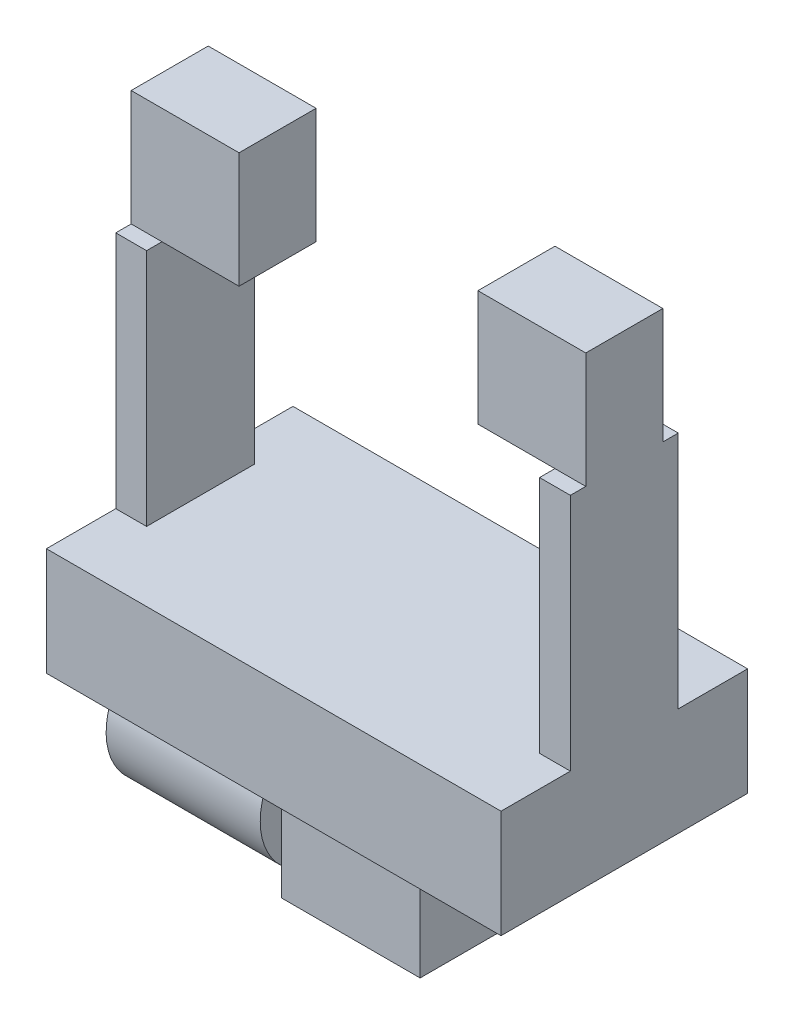
ISO-10303-21;
HEADER;
FILE_DESCRIPTION(('STEP AP214'),'2;1');
FILE_NAME('part.step','',(''),(''),'','','');
FILE_SCHEMA(('AUTOMOTIVE_DESIGN { 1 0 10303 214 1 1 1 1 }'));
ENDSEC;
DATA;
#1=APPLICATION_CONTEXT('core data for automotive mechanical design processes');
#2=APPLICATION_PROTOCOL_DEFINITION('international standard','automotive_design',2000,#1);
#3=PRODUCT_CONTEXT('',#1,'mechanical');
#4=PRODUCT('Part','Part','',(#3));
#5=PRODUCT_RELATED_PRODUCT_CATEGORY('part','',(#4));
#6=PRODUCT_DEFINITION_FORMATION('','',#4);
#7=PRODUCT_DEFINITION_CONTEXT('part definition',#1,'design');
#8=PRODUCT_DEFINITION('design','',#6,#7);
#9=PRODUCT_DEFINITION_SHAPE('','',#8);
#10=(LENGTH_UNIT() NAMED_UNIT(*) SI_UNIT(.MILLI.,.METRE.));
#11=(NAMED_UNIT(*) PLANE_ANGLE_UNIT() SI_UNIT($,.RADIAN.));
#12=(NAMED_UNIT(*) SI_UNIT($,.STERADIAN.) SOLID_ANGLE_UNIT());
#13=UNCERTAINTY_MEASURE_WITH_UNIT(LENGTH_MEASURE(1.E-05),#10,'distance_accuracy_value','');
#14=(GEOMETRIC_REPRESENTATION_CONTEXT(3) GLOBAL_UNCERTAINTY_ASSIGNED_CONTEXT((#13)) GLOBAL_UNIT_ASSIGNED_CONTEXT((#10,
#11,#12)) REPRESENTATION_CONTEXT('',''));
#15=CARTESIAN_POINT('',(0.,0.,0.));
#16=DIRECTION('',(0.,0.,1.));
#17=DIRECTION('',(1.,0.,0.));
#18=AXIS2_PLACEMENT_3D('',#15,#16,#17);
#19=CARTESIAN_POINT('',(-11.43,-8.89,7.62));
#20=DIRECTION('',(1.,0.,0.));
#21=DIRECTION('',(0.,1.,0.));
#22=AXIS2_PLACEMENT_3D('',#19,#20,#21);
#23=PLANE('',#22);
#24=CARTESIAN_POINT('',(-11.43,-21.59,0.));
#25=DIRECTION('',(-1.,0.,0.));
#26=DIRECTION('',(0.,-1.,0.));
#27=AXIS2_PLACEMENT_3D('',#24,#25,#26);
#28=CIRCLE('',#27,11.1125);
#29=CARTESIAN_POINT('',(-11.43,-13.5015356061858,7.62));
#30=VERTEX_POINT('',#29);
#31=CARTESIAN_POINT('',(-11.43,-13.5015356061858,-7.62));
#32=VERTEX_POINT('',#31);
#33=EDGE_CURVE('E67',#30,#32,#28,.T.);
#34=ORIENTED_EDGE('',*,*,#33,.F.);
#35=DIRECTION('',(0.,-1.,0.));
#36=VECTOR('',#35,1.);
#37=CARTESIAN_POINT('',(-11.43,-8.89,7.62));
#38=LINE('',#37,#36);
#39=CARTESIAN_POINT('',(-11.43,-8.89,7.62));
#40=VERTEX_POINT('',#39);
#41=EDGE_CURVE('E242',#40,#30,#38,.T.);
#42=ORIENTED_EDGE('',*,*,#41,.F.);
#43=DIRECTION('',(0.,0.,-1.));
#44=VECTOR('',#43,1.);
#45=CARTESIAN_POINT('',(-11.43,-8.89,7.62));
#46=LINE('',#45,#44);
#47=CARTESIAN_POINT('',(-11.43,-8.89,-7.62));
#48=VERTEX_POINT('',#47);
#49=EDGE_CURVE('E282',#40,#48,#46,.T.);
#50=ORIENTED_EDGE('',*,*,#49,.T.);
#51=DIRECTION('',(0.,-1.,0.));
#52=VECTOR('',#51,1.);
#53=CARTESIAN_POINT('',(-11.43,-8.89,-7.62));
#54=LINE('',#53,#52);
#55=EDGE_CURVE('E284',#48,#32,#54,.T.);
#56=ORIENTED_EDGE('',*,*,#55,.T.);
#57=EDGE_LOOP('',(#34,#42,#50,#56));
#58=FACE_BOUND('',#57,.T.);
#59=ADVANCED_FACE('F47',(#58),#23,.F.);
#60=CARTESIAN_POINT('',(37.465,48.26,8.89));
#61=DIRECTION('',(0.,-1.,0.));
#62=DIRECTION('',(0.,0.,-1.));
#63=AXIS2_PLACEMENT_3D('',#60,#61,#62);
#64=PLANE('',#63);
#65=DIRECTION('',(1.,0.,0.));
#66=VECTOR('',#65,1.);
#67=CARTESIAN_POINT('',(37.465,48.26,6.35));
#68=LINE('',#67,#66);
#69=CARTESIAN_POINT('',(32.385,48.26,6.35));
#70=VERTEX_POINT('',#69);
#71=CARTESIAN_POINT('',(37.465,48.26,6.35));
#72=VERTEX_POINT('',#71);
#73=EDGE_CURVE('E58',#70,#72,#68,.T.);
#74=ORIENTED_EDGE('',*,*,#73,.F.);
#75=DIRECTION('',(0.,0.,-1.));
#76=VECTOR('',#75,1.);
#77=CARTESIAN_POINT('',(32.385,48.26,8.89));
#78=LINE('',#77,#76);
#79=CARTESIAN_POINT('',(32.385,48.26,8.89));
#80=VERTEX_POINT('',#79);
#81=EDGE_CURVE('E425',#80,#70,#78,.T.);
#82=ORIENTED_EDGE('',*,*,#81,.F.);
#83=DIRECTION('',(-1.,0.,0.));
#84=VECTOR('',#83,1.);
#85=CARTESIAN_POINT('',(37.465,48.26,8.89));
#86=LINE('',#85,#84);
#87=CARTESIAN_POINT('',(37.465,48.26,8.89));
#88=VERTEX_POINT('',#87);
#89=EDGE_CURVE('E455',#88,#80,#86,.T.);
#90=ORIENTED_EDGE('',*,*,#89,.F.);
#91=DIRECTION('',(0.,0.,-1.));
#92=VECTOR('',#91,1.);
#93=CARTESIAN_POINT('',(37.465,48.26,8.89));
#94=LINE('',#93,#92);
#95=EDGE_CURVE('E418',#88,#72,#94,.T.);
#96=ORIENTED_EDGE('',*,*,#95,.T.);
#97=EDGE_LOOP('',(#74,#82,#90,#96));
#98=FACE_BOUND('',#97,.T.);
#99=ADVANCED_FACE('F602',(#98),#64,.F.);
#100=CARTESIAN_POINT('',(-37.465,48.26,8.89));
#101=DIRECTION('',(0.,-1.,0.));
#102=DIRECTION('',(0.,0.,-1.));
#103=AXIS2_PLACEMENT_3D('',#100,#101,#102);
#104=PLANE('',#103);
#105=DIRECTION('',(1.,0.,0.));
#106=VECTOR('',#105,1.);
#107=CARTESIAN_POINT('',(-37.465,48.26,6.35));
#108=LINE('',#107,#106);
#109=CARTESIAN_POINT('',(-37.465,48.26,6.35));
#110=VERTEX_POINT('',#109);
#111=CARTESIAN_POINT('',(-32.385,48.26,6.35));
#112=VERTEX_POINT('',#111);
#113=EDGE_CURVE('E373',#110,#112,#108,.T.);
#114=ORIENTED_EDGE('',*,*,#113,.F.);
#115=DIRECTION('',(0.,0.,-1.));
#116=VECTOR('',#115,1.);
#117=CARTESIAN_POINT('',(-37.465,48.26,8.89));
#118=LINE('',#117,#116);
#119=CARTESIAN_POINT('',(-37.465,48.26,8.89));
#120=VERTEX_POINT('',#119);
#121=EDGE_CURVE('E406',#120,#110,#118,.T.);
#122=ORIENTED_EDGE('',*,*,#121,.F.);
#123=DIRECTION('',(-1.,0.,0.));
#124=VECTOR('',#123,1.);
#125=CARTESIAN_POINT('',(-37.465,48.26,8.89));
#126=LINE('',#125,#124);
#127=CARTESIAN_POINT('',(-32.385,48.26,8.89));
#128=VERTEX_POINT('',#127);
#129=EDGE_CURVE('E387',#128,#120,#126,.T.);
#130=ORIENTED_EDGE('',*,*,#129,.F.);
#131=DIRECTION('',(0.,0.,-1.));
#132=VECTOR('',#131,1.);
#133=CARTESIAN_POINT('',(-32.385,48.26,8.89));
#134=LINE('',#133,#132);
#135=EDGE_CURVE('E413',#128,#112,#134,.T.);
#136=ORIENTED_EDGE('',*,*,#135,.T.);
#137=EDGE_LOOP('',(#114,#122,#130,#136));
#138=FACE_BOUND('',#137,.T.);
#139=ADVANCED_FACE('F607',(#138),#104,.F.);
#140=CARTESIAN_POINT('',(37.465,-8.89,20.32));
#141=DIRECTION('',(-1.,0.,0.));
#142=DIRECTION('',(0.,0.,1.));
#143=AXIS2_PLACEMENT_3D('',#140,#141,#142);
#144=PLANE('',#143);
#145=DIRECTION('',(0.,1.,0.));
#146=VECTOR('',#145,1.);
#147=CARTESIAN_POINT('',(37.465,-8.89,-20.32));
#148=LINE('',#147,#146);
#149=CARTESIAN_POINT('',(37.465,-8.89,-20.32));
#150=VERTEX_POINT('',#149);
#151=CARTESIAN_POINT('',(37.465,8.89,-20.32));
#152=VERTEX_POINT('',#151);
#153=EDGE_CURVE('E416',#150,#152,#148,.T.);
#154=ORIENTED_EDGE('',*,*,#153,.T.);
#155=DIRECTION('',(0.,0.,-1.));
#156=VECTOR('',#155,1.);
#157=CARTESIAN_POINT('',(37.465,8.89,20.32));
#158=LINE('',#157,#156);
#159=CARTESIAN_POINT('',(37.465,8.89,-8.89));
#160=VERTEX_POINT('',#159);
#161=EDGE_CURVE('E497',#160,#152,#158,.T.);
#162=ORIENTED_EDGE('',*,*,#161,.F.);
#163=DIRECTION('',(0.,1.,0.));
#164=VECTOR('',#163,1.);
#165=CARTESIAN_POINT('',(37.465,8.89,-8.89));
#166=LINE('',#165,#164);
#167=CARTESIAN_POINT('',(37.465,48.26,-8.89));
#168=VERTEX_POINT('',#167);
#169=EDGE_CURVE('E397',#160,#168,#166,.T.);
#170=ORIENTED_EDGE('',*,*,#169,.T.);
#171=CARTESIAN_POINT('',(37.465,48.26,-6.35));
#172=VERTEX_POINT('',#171);
#173=EDGE_CURVE('E352',#172,#168,#94,.T.);
#174=ORIENTED_EDGE('',*,*,#173,.F.);
#175=DIRECTION('',(0.,1.,0.));
#176=VECTOR('',#175,1.);
#177=CARTESIAN_POINT('',(37.465,48.26,-6.35));
#178=LINE('',#177,#176);
#179=CARTESIAN_POINT('',(37.465,67.31,-6.35));
#180=VERTEX_POINT('',#179);
#181=EDGE_CURVE('E330',#172,#180,#178,.T.);
#182=ORIENTED_EDGE('',*,*,#181,.T.);
#183=DIRECTION('',(0.,0.,-1.));
#184=VECTOR('',#183,1.);
#185=CARTESIAN_POINT('',(37.465,67.31,6.35));
#186=LINE('',#185,#184);
#187=CARTESIAN_POINT('',(37.465,67.31,6.35));
#188=VERTEX_POINT('',#187);
#189=EDGE_CURVE('E350',#188,#180,#186,.T.);
#190=ORIENTED_EDGE('',*,*,#189,.F.);
#191=DIRECTION('',(0.,1.,0.));
#192=VECTOR('',#191,1.);
#193=CARTESIAN_POINT('',(37.465,48.26,6.35));
#194=LINE('',#193,#192);
#195=EDGE_CURVE('E315',#72,#188,#194,.T.);
#196=ORIENTED_EDGE('',*,*,#195,.F.);
#197=ORIENTED_EDGE('',*,*,#95,.F.);
#198=DIRECTION('',(0.,1.,0.));
#199=VECTOR('',#198,1.);
#200=CARTESIAN_POINT('',(37.465,8.89,8.89));
#201=LINE('',#200,#199);
#202=CARTESIAN_POINT('',(37.465,8.89,8.89));
#203=VERTEX_POINT('',#202);
#204=EDGE_CURVE('E437',#203,#88,#201,.T.);
#205=ORIENTED_EDGE('',*,*,#204,.F.);
#206=CARTESIAN_POINT('',(37.465,8.89,20.32));
#207=VERTEX_POINT('',#206);
#208=EDGE_CURVE('E52',#207,#203,#158,.T.);
#209=ORIENTED_EDGE('',*,*,#208,.F.);
#210=DIRECTION('',(0.,1.,0.));
#211=VECTOR('',#210,1.);
#212=CARTESIAN_POINT('',(37.465,-8.89,20.32));
#213=LINE('',#212,#211);
#214=CARTESIAN_POINT('',(37.465,-8.89,20.32));
#215=VERTEX_POINT('',#214);
#216=EDGE_CURVE('E462',#215,#207,#213,.T.);
#217=ORIENTED_EDGE('',*,*,#216,.F.);
#218=DIRECTION('',(0.,0.,-1.));
#219=VECTOR('',#218,1.);
#220=CARTESIAN_POINT('',(37.465,-8.89,20.32));
#221=LINE('',#220,#219);
#222=EDGE_CURVE('E487',#215,#150,#221,.T.);
#223=ORIENTED_EDGE('',*,*,#222,.T.);
#224=EDGE_LOOP('',(#154,#162,#170,#174,#182,#190,#196,#197,#205,#209,#217,#223));
#225=FACE_BOUND('',#224,.T.);
#226=ADVANCED_FACE('F51',(#225),#144,.F.);
#227=CARTESIAN_POINT('',(-37.465,8.89,20.32));
#228=DIRECTION('',(0.,-1.,0.));
#229=DIRECTION('',(0.,0.,-1.));
#230=AXIS2_PLACEMENT_3D('',#227,#228,#229);
#231=PLANE('',#230);
#232=DIRECTION('',(0.,0.,-1.));
#233=VECTOR('',#232,1.);
#234=CARTESIAN_POINT('',(-37.465,8.89,20.32));
#235=LINE('',#234,#233);
#236=CARTESIAN_POINT('',(-37.465,8.89,-8.89));
#237=VERTEX_POINT('',#236);
#238=CARTESIAN_POINT('',(-37.465,8.89,-20.32));
#239=VERTEX_POINT('',#238);
#240=EDGE_CURVE('E492',#237,#239,#235,.T.);
#241=ORIENTED_EDGE('',*,*,#240,.F.);
#242=DIRECTION('',(1.,0.,0.));
#243=VECTOR('',#242,1.);
#244=CARTESIAN_POINT('',(-37.465,8.89,-8.89));
#245=LINE('',#244,#243);
#246=CARTESIAN_POINT('',(-32.385,8.89,-8.89));
#247=VERTEX_POINT('',#246);
#248=EDGE_CURVE('E394',#237,#247,#245,.T.);
#249=ORIENTED_EDGE('',*,*,#248,.T.);
#250=DIRECTION('',(0.,0.,-1.));
#251=VECTOR('',#250,1.);
#252=CARTESIAN_POINT('',(-32.385,8.89,8.89));
#253=LINE('',#252,#251);
#254=CARTESIAN_POINT('',(-32.385,8.89,8.89));
#255=VERTEX_POINT('',#254);
#256=EDGE_CURVE('E412',#255,#247,#253,.T.);
#257=ORIENTED_EDGE('',*,*,#256,.F.);
#258=DIRECTION('',(1.,0.,0.));
#259=VECTOR('',#258,1.);
#260=CARTESIAN_POINT('',(-37.465,8.89,8.89));
#261=LINE('',#260,#259);
#262=CARTESIAN_POINT('',(-37.465,8.89,8.89));
#263=VERTEX_POINT('',#262);
#264=EDGE_CURVE('E378',#263,#255,#261,.T.);
#265=ORIENTED_EDGE('',*,*,#264,.F.);
#266=CARTESIAN_POINT('',(-37.465,8.89,20.32));
#267=VERTEX_POINT('',#266);
#268=EDGE_CURVE('E496',#267,#263,#235,.T.);
#269=ORIENTED_EDGE('',*,*,#268,.F.);
#270=DIRECTION('',(-1.,0.,0.));
#271=VECTOR('',#270,1.);
#272=CARTESIAN_POINT('',(-37.465,8.89,20.32));
#273=LINE('',#272,#271);
#274=EDGE_CURVE('E463',#207,#267,#273,.T.);
#275=ORIENTED_EDGE('',*,*,#274,.F.);
#276=ORIENTED_EDGE('',*,*,#208,.T.);
#277=DIRECTION('',(1.,0.,0.));
#278=VECTOR('',#277,1.);
#279=CARTESIAN_POINT('',(37.465,8.89,8.89));
#280=LINE('',#279,#278);
#281=CARTESIAN_POINT('',(32.385,8.89,8.89));
#282=VERTEX_POINT('',#281);
#283=EDGE_CURVE('E433',#282,#203,#280,.T.);
#284=ORIENTED_EDGE('',*,*,#283,.F.);
#285=DIRECTION('',(0.,0.,-1.));
#286=VECTOR('',#285,1.);
#287=CARTESIAN_POINT('',(32.385,8.89,8.89));
#288=LINE('',#287,#286);
#289=CARTESIAN_POINT('',(32.385,8.89,-8.89));
#290=VERTEX_POINT('',#289);
#291=EDGE_CURVE('E426',#282,#290,#288,.T.);
#292=ORIENTED_EDGE('',*,*,#291,.T.);
#293=DIRECTION('',(1.,0.,0.));
#294=VECTOR('',#293,1.);
#295=CARTESIAN_POINT('',(37.465,8.89,-8.89));
#296=LINE('',#295,#294);
#297=EDGE_CURVE('E432',#290,#160,#296,.T.);
#298=ORIENTED_EDGE('',*,*,#297,.T.);
#299=ORIENTED_EDGE('',*,*,#161,.T.);
#300=DIRECTION('',(-1.,0.,0.));
#301=VECTOR('',#300,1.);
#302=CARTESIAN_POINT('',(-37.465,8.89,-20.32));
#303=LINE('',#302,#301);
#304=EDGE_CURVE('E475',#152,#239,#303,.T.);
#305=ORIENTED_EDGE('',*,*,#304,.T.);
#306=EDGE_LOOP('',(#241,#249,#257,#265,#269,#275,#276,#284,#292,#298,#299,#305));
#307=FACE_BOUND('',#306,.T.);
#308=ADVANCED_FACE('F514',(#307),#231,.F.);
#309=CARTESIAN_POINT('',(-37.465,-8.89,20.32));
#310=DIRECTION('',(1.,0.,0.));
#311=DIRECTION('',(0.,0.,-1.));
#312=AXIS2_PLACEMENT_3D('',#309,#310,#311);
#313=PLANE('',#312);
#314=DIRECTION('',(0.,-1.,0.));
#315=VECTOR('',#314,1.);
#316=CARTESIAN_POINT('',(-37.465,-8.89,-20.32));
#317=LINE('',#316,#315);
#318=CARTESIAN_POINT('',(-37.465,-8.89,-20.32));
#319=VERTEX_POINT('',#318);
#320=EDGE_CURVE('E482',#239,#319,#317,.T.);
#321=ORIENTED_EDGE('',*,*,#320,.T.);
#322=DIRECTION('',(0.,0.,-1.));
#323=VECTOR('',#322,1.);
#324=CARTESIAN_POINT('',(-37.465,-8.89,20.32));
#325=LINE('',#324,#323);
#326=CARTESIAN_POINT('',(-37.465,-8.89,20.32));
#327=VERTEX_POINT('',#326);
#328=EDGE_CURVE('E493',#327,#319,#325,.T.);
#329=ORIENTED_EDGE('',*,*,#328,.F.);
#330=DIRECTION('',(0.,-1.,0.));
#331=VECTOR('',#330,1.);
#332=CARTESIAN_POINT('',(-37.465,-8.89,20.32));
#333=LINE('',#332,#331);
#334=EDGE_CURVE('E468',#267,#327,#333,.T.);
#335=ORIENTED_EDGE('',*,*,#334,.F.);
#336=ORIENTED_EDGE('',*,*,#268,.T.);
#337=DIRECTION('',(0.,-1.,0.));
#338=VECTOR('',#337,1.);
#339=CARTESIAN_POINT('',(-37.465,8.89,8.89));
#340=LINE('',#339,#338);
#341=EDGE_CURVE('E374',#120,#263,#340,.T.);
#342=ORIENTED_EDGE('',*,*,#341,.F.);
#343=ORIENTED_EDGE('',*,*,#121,.T.);
#344=DIRECTION('',(0.,-1.,0.));
#345=VECTOR('',#344,1.);
#346=CARTESIAN_POINT('',(-37.465,48.26,6.35));
#347=LINE('',#346,#345);
#348=CARTESIAN_POINT('',(-37.465,67.31,6.35));
#349=VERTEX_POINT('',#348);
#350=EDGE_CURVE('E366',#349,#110,#347,.T.);
#351=ORIENTED_EDGE('',*,*,#350,.F.);
#352=DIRECTION('',(0.,0.,-1.));
#353=VECTOR('',#352,1.);
#354=CARTESIAN_POINT('',(-37.465,67.31,6.35));
#355=LINE('',#354,#353);
#356=CARTESIAN_POINT('',(-37.465,67.31,-6.35));
#357=VERTEX_POINT('',#356);
#358=EDGE_CURVE('E563',#349,#357,#355,.T.);
#359=ORIENTED_EDGE('',*,*,#358,.T.);
#360=DIRECTION('',(0.,-1.,0.));
#361=VECTOR('',#360,1.);
#362=CARTESIAN_POINT('',(-37.465,48.26,-6.35));
#363=LINE('',#362,#361);
#364=CARTESIAN_POINT('',(-37.465,48.26,-6.35));
#365=VERTEX_POINT('',#364);
#366=EDGE_CURVE('E334',#357,#365,#363,.T.);
#367=ORIENTED_EDGE('',*,*,#366,.T.);
#368=CARTESIAN_POINT('',(-37.465,48.26,-8.89));
#369=VERTEX_POINT('',#368);
#370=EDGE_CURVE('E390',#365,#369,#118,.T.);
#371=ORIENTED_EDGE('',*,*,#370,.T.);
#372=DIRECTION('',(0.,-1.,0.));
#373=VECTOR('',#372,1.);
#374=CARTESIAN_POINT('',(-37.465,8.89,-8.89));
#375=LINE('',#374,#373);
#376=EDGE_CURVE('E393',#369,#237,#375,.T.);
#377=ORIENTED_EDGE('',*,*,#376,.T.);
#378=ORIENTED_EDGE('',*,*,#240,.T.);
#379=EDGE_LOOP('',(#321,#329,#335,#336,#342,#343,#351,#359,#367,#371,#377,#378));
#380=FACE_BOUND('',#379,.T.);
#381=ADVANCED_FACE('F506',(#380),#313,.F.);
#382=CARTESIAN_POINT('',(-37.465,-8.89,20.32));
#383=DIRECTION('',(0.,1.,0.));
#384=DIRECTION('',(0.,0.,1.));
#385=AXIS2_PLACEMENT_3D('',#382,#383,#384);
#386=PLANE('',#385);
#387=DIRECTION('',(0.,0.,-1.));
#388=VECTOR('',#387,1.);
#389=CARTESIAN_POINT('',(11.43,-8.89,7.62));
#390=LINE('',#389,#388);
#391=CARTESIAN_POINT('',(11.43,-8.89,7.62));
#392=VERTEX_POINT('',#391);
#393=CARTESIAN_POINT('',(11.43,-8.89,-7.62));
#394=VERTEX_POINT('',#393);
#395=EDGE_CURVE('E301',#392,#394,#390,.T.);
#396=ORIENTED_EDGE('',*,*,#395,.T.);
#397=DIRECTION('',(-1.,0.,0.));
#398=VECTOR('',#397,1.);
#399=CARTESIAN_POINT('',(-11.43,-8.89,-7.62));
#400=LINE('',#399,#398);
#401=EDGE_CURVE('E257',#394,#48,#400,.T.);
#402=ORIENTED_EDGE('',*,*,#401,.T.);
#403=ORIENTED_EDGE('',*,*,#49,.F.);
#404=DIRECTION('',(-1.,0.,0.));
#405=VECTOR('',#404,1.);
#406=CARTESIAN_POINT('',(-11.43,-8.89,7.62));
#407=LINE('',#406,#405);
#408=EDGE_CURVE('E283',#392,#40,#407,.T.);
#409=ORIENTED_EDGE('',*,*,#408,.F.);
#410=EDGE_LOOP('',(#396,#402,#403,#409));
#411=FACE_BOUND('',#410,.T.);
#412=DIRECTION('',(1.,0.,0.));
#413=VECTOR('',#412,1.);
#414=CARTESIAN_POINT('',(-37.465,-8.89,-20.32));
#415=LINE('',#414,#413);
#416=EDGE_CURVE('E467',#319,#150,#415,.T.);
#417=ORIENTED_EDGE('',*,*,#416,.T.);
#418=ORIENTED_EDGE('',*,*,#222,.F.);
#419=DIRECTION('',(1.,0.,0.));
#420=VECTOR('',#419,1.);
#421=CARTESIAN_POINT('',(-37.465,-8.89,20.32));
#422=LINE('',#421,#420);
#423=EDGE_CURVE('E495',#327,#215,#422,.T.);
#424=ORIENTED_EDGE('',*,*,#423,.F.);
#425=ORIENTED_EDGE('',*,*,#328,.T.);
#426=EDGE_LOOP('',(#417,#418,#424,#425));
#427=FACE_BOUND('',#426,.T.);
#428=ADVANCED_FACE('F525',(#411,#427),#386,.F.);
#429=CARTESIAN_POINT('',(0.,0.,20.32));
#430=DIRECTION('',(0.,0.,-1.));
#431=DIRECTION('',(-1.,0.,0.));
#432=AXIS2_PLACEMENT_3D('',#429,#430,#431);
#433=PLANE('',#432);
#434=ORIENTED_EDGE('',*,*,#216,.T.);
#435=ORIENTED_EDGE('',*,*,#274,.T.);
#436=ORIENTED_EDGE('',*,*,#334,.T.);
#437=ORIENTED_EDGE('',*,*,#423,.T.);
#438=EDGE_LOOP('',(#434,#435,#436,#437));
#439=FACE_BOUND('',#438,.T.);
#440=ADVANCED_FACE('F528',(#439),#433,.F.);
#441=CARTESIAN_POINT('',(0.,0.,-20.32));
#442=DIRECTION('',(0.,0.,-1.));
#443=DIRECTION('',(-1.,0.,0.));
#444=AXIS2_PLACEMENT_3D('',#441,#442,#443);
#445=PLANE('',#444);
#446=ORIENTED_EDGE('',*,*,#153,.F.);
#447=ORIENTED_EDGE('',*,*,#416,.F.);
#448=ORIENTED_EDGE('',*,*,#320,.F.);
#449=ORIENTED_EDGE('',*,*,#304,.F.);
#450=EDGE_LOOP('',(#446,#447,#448,#449));
#451=FACE_BOUND('',#450,.T.);
#452=ADVANCED_FACE('F518',(#451),#445,.T.);
#453=CARTESIAN_POINT('',(32.385,48.26,-6.35));
#454=VERTEX_POINT('',#453);
#455=CARTESIAN_POINT('',(32.385,48.26,-8.89));
#456=VERTEX_POINT('',#455);
#457=EDGE_CURVE('E421',#454,#456,#78,.T.);
#458=ORIENTED_EDGE('',*,*,#457,.F.);
#459=DIRECTION('',(1.,0.,0.));
#460=VECTOR('',#459,1.);
#461=CARTESIAN_POINT('',(37.465,48.26,-6.35));
#462=LINE('',#461,#460);
#463=EDGE_CURVE('E12',#454,#172,#462,.T.);
#464=ORIENTED_EDGE('',*,*,#463,.T.);
#465=ORIENTED_EDGE('',*,*,#173,.T.);
#466=DIRECTION('',(-1.,0.,0.));
#467=VECTOR('',#466,1.);
#468=CARTESIAN_POINT('',(37.465,48.26,-8.89));
#469=LINE('',#468,#467);
#470=EDGE_CURVE('E442',#168,#456,#469,.T.);
#471=ORIENTED_EDGE('',*,*,#470,.T.);
#472=EDGE_LOOP('',(#458,#464,#465,#471));
#473=FACE_BOUND('',#472,.T.);
#474=ADVANCED_FACE('F614',(#473),#64,.F.);
#475=CARTESIAN_POINT('',(32.385,8.89,8.89));
#476=DIRECTION('',(1.,0.,0.));
#477=DIRECTION('',(0.,0.,-1.));
#478=AXIS2_PLACEMENT_3D('',#475,#476,#477);
#479=PLANE('',#478);
#480=DIRECTION('',(0.,-1.,0.));
#481=VECTOR('',#480,1.);
#482=CARTESIAN_POINT('',(32.385,8.89,-8.89));
#483=LINE('',#482,#481);
#484=EDGE_CURVE('E438',#456,#290,#483,.T.);
#485=ORIENTED_EDGE('',*,*,#484,.T.);
#486=ORIENTED_EDGE('',*,*,#291,.F.);
#487=DIRECTION('',(0.,-1.,0.));
#488=VECTOR('',#487,1.);
#489=CARTESIAN_POINT('',(32.385,8.89,8.89));
#490=LINE('',#489,#488);
#491=EDGE_CURVE('E452',#80,#282,#490,.T.);
#492=ORIENTED_EDGE('',*,*,#491,.F.);
#493=ORIENTED_EDGE('',*,*,#81,.T.);
#494=EDGE_CURVE('E429',#70,#454,#78,.T.);
#495=ORIENTED_EDGE('',*,*,#494,.T.);
#496=ORIENTED_EDGE('',*,*,#457,.T.);
#497=EDGE_LOOP('',(#485,#486,#492,#493,#495,#496));
#498=FACE_BOUND('',#497,.T.);
#499=ADVANCED_FACE('F683',(#498),#479,.F.);
#500=CARTESIAN_POINT('',(0.,0.,8.89));
#501=DIRECTION('',(0.,0.,1.));
#502=DIRECTION('',(1.,0.,0.));
#503=AXIS2_PLACEMENT_3D('',#500,#501,#502);
#504=PLANE('',#503);
#505=ORIENTED_EDGE('',*,*,#204,.T.);
#506=ORIENTED_EDGE('',*,*,#89,.T.);
#507=ORIENTED_EDGE('',*,*,#491,.T.);
#508=ORIENTED_EDGE('',*,*,#283,.T.);
#509=EDGE_LOOP('',(#505,#506,#507,#508));
#510=FACE_BOUND('',#509,.T.);
#511=ADVANCED_FACE('F684',(#510),#504,.T.);
#512=CARTESIAN_POINT('',(0.,0.,-8.89));
#513=DIRECTION('',(0.,0.,1.));
#514=DIRECTION('',(1.,0.,0.));
#515=AXIS2_PLACEMENT_3D('',#512,#513,#514);
#516=PLANE('',#515);
#517=ORIENTED_EDGE('',*,*,#169,.F.);
#518=ORIENTED_EDGE('',*,*,#297,.F.);
#519=ORIENTED_EDGE('',*,*,#484,.F.);
#520=ORIENTED_EDGE('',*,*,#470,.F.);
#521=EDGE_LOOP('',(#517,#518,#519,#520));
#522=FACE_BOUND('',#521,.T.);
#523=ADVANCED_FACE('F679',(#522),#516,.F.);
#524=CARTESIAN_POINT('',(-32.385,8.89,8.89));
#525=DIRECTION('',(-1.,0.,0.));
#526=DIRECTION('',(0.,0.,1.));
#527=AXIS2_PLACEMENT_3D('',#524,#525,#526);
#528=PLANE('',#527);
#529=DIRECTION('',(0.,1.,0.));
#530=VECTOR('',#529,1.);
#531=CARTESIAN_POINT('',(-32.385,8.89,-8.89));
#532=LINE('',#531,#530);
#533=CARTESIAN_POINT('',(-32.385,48.26,-8.89));
#534=VERTEX_POINT('',#533);
#535=EDGE_CURVE('E396',#247,#534,#532,.T.);
#536=ORIENTED_EDGE('',*,*,#535,.T.);
#537=CARTESIAN_POINT('',(-32.385,48.26,-6.35));
#538=VERTEX_POINT('',#537);
#539=EDGE_CURVE('E410',#538,#534,#134,.T.);
#540=ORIENTED_EDGE('',*,*,#539,.F.);
#541=EDGE_CURVE('E414',#112,#538,#134,.T.);
#542=ORIENTED_EDGE('',*,*,#541,.F.);
#543=ORIENTED_EDGE('',*,*,#135,.F.);
#544=DIRECTION('',(0.,1.,0.));
#545=VECTOR('',#544,1.);
#546=CARTESIAN_POINT('',(-32.385,8.89,8.89));
#547=LINE('',#546,#545);
#548=EDGE_CURVE('E381',#255,#128,#547,.T.);
#549=ORIENTED_EDGE('',*,*,#548,.F.);
#550=ORIENTED_EDGE('',*,*,#256,.T.);
#551=EDGE_LOOP('',(#536,#540,#542,#543,#549,#550));
#552=FACE_BOUND('',#551,.T.);
#553=ADVANCED_FACE('F672',(#552),#528,.F.);
#554=ORIENTED_EDGE('',*,*,#370,.F.);
#555=DIRECTION('',(1.,0.,0.));
#556=VECTOR('',#555,1.);
#557=CARTESIAN_POINT('',(-37.465,48.26,-6.35));
#558=LINE('',#557,#556);
#559=EDGE_CURVE('E544',#365,#538,#558,.T.);
#560=ORIENTED_EDGE('',*,*,#559,.T.);
#561=ORIENTED_EDGE('',*,*,#539,.T.);
#562=DIRECTION('',(-1.,0.,0.));
#563=VECTOR('',#562,1.);
#564=CARTESIAN_POINT('',(-37.465,48.26,-8.89));
#565=LINE('',#564,#563);
#566=EDGE_CURVE('E379',#534,#369,#565,.T.);
#567=ORIENTED_EDGE('',*,*,#566,.T.);
#568=EDGE_LOOP('',(#554,#560,#561,#567));
#569=FACE_BOUND('',#568,.T.);
#570=ADVANCED_FACE('F667',(#569),#104,.F.);
#571=CARTESIAN_POINT('',(0.,0.,8.89));
#572=DIRECTION('',(0.,0.,-1.));
#573=DIRECTION('',(-1.,0.,0.));
#574=AXIS2_PLACEMENT_3D('',#571,#572,#573);
#575=PLANE('',#574);
#576=ORIENTED_EDGE('',*,*,#341,.T.);
#577=ORIENTED_EDGE('',*,*,#264,.T.);
#578=ORIENTED_EDGE('',*,*,#548,.T.);
#579=ORIENTED_EDGE('',*,*,#129,.T.);
#580=EDGE_LOOP('',(#576,#577,#578,#579));
#581=FACE_BOUND('',#580,.T.);
#582=ADVANCED_FACE('F664',(#581),#575,.F.);
#583=CARTESIAN_POINT('',(0.,0.,-8.89));
#584=DIRECTION('',(0.,0.,-1.));
#585=DIRECTION('',(-1.,0.,0.));
#586=AXIS2_PLACEMENT_3D('',#583,#584,#585);
#587=PLANE('',#586);
#588=ORIENTED_EDGE('',*,*,#376,.F.);
#589=ORIENTED_EDGE('',*,*,#566,.F.);
#590=ORIENTED_EDGE('',*,*,#535,.F.);
#591=ORIENTED_EDGE('',*,*,#248,.F.);
#592=EDGE_LOOP('',(#588,#589,#590,#591));
#593=FACE_BOUND('',#592,.T.);
#594=ADVANCED_FACE('F649',(#593),#587,.T.);
#595=CARTESIAN_POINT('',(-37.465,48.26,6.35));
#596=DIRECTION('',(0.,1.,0.));
#597=DIRECTION('',(0.,0.,1.));
#598=AXIS2_PLACEMENT_3D('',#595,#596,#597);
#599=PLANE('',#598);
#600=CARTESIAN_POINT('',(-19.685,48.26,6.35));
#601=VERTEX_POINT('',#600);
#602=EDGE_CURVE('E560',#112,#601,#108,.T.);
#603=ORIENTED_EDGE('',*,*,#602,.F.);
#604=ORIENTED_EDGE('',*,*,#541,.T.);
#605=CARTESIAN_POINT('',(-19.685,48.26,-6.35));
#606=VERTEX_POINT('',#605);
#607=EDGE_CURVE('E550',#538,#606,#558,.T.);
#608=ORIENTED_EDGE('',*,*,#607,.T.);
#609=DIRECTION('',(0.,0.,-1.));
#610=VECTOR('',#609,1.);
#611=CARTESIAN_POINT('',(-19.685,48.26,6.35));
#612=LINE('',#611,#610);
#613=EDGE_CURVE('E311',#601,#606,#612,.T.);
#614=ORIENTED_EDGE('',*,*,#613,.F.);
#615=EDGE_LOOP('',(#603,#604,#608,#614));
#616=FACE_BOUND('',#615,.T.);
#617=ADVANCED_FACE('F641',(#616),#599,.F.);
#618=CARTESIAN_POINT('',(-19.685,48.26,6.35));
#619=DIRECTION('',(-1.,0.,0.));
#620=DIRECTION('',(0.,0.,1.));
#621=AXIS2_PLACEMENT_3D('',#618,#619,#620);
#622=PLANE('',#621);
#623=DIRECTION('',(0.,1.,0.));
#624=VECTOR('',#623,1.);
#625=CARTESIAN_POINT('',(-19.685,48.26,-6.35));
#626=LINE('',#625,#624);
#627=CARTESIAN_POINT('',(-19.685,67.31,-6.35));
#628=VERTEX_POINT('',#627);
#629=EDGE_CURVE('E553',#606,#628,#626,.T.);
#630=ORIENTED_EDGE('',*,*,#629,.T.);
#631=DIRECTION('',(0.,0.,-1.));
#632=VECTOR('',#631,1.);
#633=CARTESIAN_POINT('',(-19.685,67.31,6.35));
#634=LINE('',#633,#632);
#635=CARTESIAN_POINT('',(-19.685,67.31,6.35));
#636=VERTEX_POINT('',#635);
#637=EDGE_CURVE('E358',#636,#628,#634,.T.);
#638=ORIENTED_EDGE('',*,*,#637,.F.);
#639=DIRECTION('',(0.,1.,0.));
#640=VECTOR('',#639,1.);
#641=CARTESIAN_POINT('',(-19.685,48.26,6.35));
#642=LINE('',#641,#640);
#643=EDGE_CURVE('E559',#601,#636,#642,.T.);
#644=ORIENTED_EDGE('',*,*,#643,.F.);
#645=ORIENTED_EDGE('',*,*,#613,.T.);
#646=EDGE_LOOP('',(#630,#638,#644,#645));
#647=FACE_BOUND('',#646,.T.);
#648=ADVANCED_FACE('F647',(#647),#622,.F.);
#649=CARTESIAN_POINT('',(-37.465,67.31,6.35));
#650=DIRECTION('',(0.,-1.,0.));
#651=DIRECTION('',(0.,0.,-1.));
#652=AXIS2_PLACEMENT_3D('',#649,#650,#651);
#653=PLANE('',#652);
#654=DIRECTION('',(-1.,0.,0.));
#655=VECTOR('',#654,1.);
#656=CARTESIAN_POINT('',(-37.465,67.31,-6.35));
#657=LINE('',#656,#655);
#658=EDGE_CURVE('E375',#628,#357,#657,.T.);
#659=ORIENTED_EDGE('',*,*,#658,.T.);
#660=ORIENTED_EDGE('',*,*,#358,.F.);
#661=DIRECTION('',(-1.,0.,0.));
#662=VECTOR('',#661,1.);
#663=CARTESIAN_POINT('',(-37.465,67.31,6.35));
#664=LINE('',#663,#662);
#665=EDGE_CURVE('E561',#636,#349,#664,.T.);
#666=ORIENTED_EDGE('',*,*,#665,.F.);
#667=ORIENTED_EDGE('',*,*,#637,.T.);
#668=EDGE_LOOP('',(#659,#660,#666,#667));
#669=FACE_BOUND('',#668,.T.);
#670=ADVANCED_FACE('F655',(#669),#653,.F.);
#671=CARTESIAN_POINT('',(0.,0.,6.35));
#672=DIRECTION('',(0.,0.,-1.));
#673=DIRECTION('',(-1.,0.,0.));
#674=AXIS2_PLACEMENT_3D('',#671,#672,#673);
#675=PLANE('',#674);
#676=ORIENTED_EDGE('',*,*,#350,.T.);
#677=ORIENTED_EDGE('',*,*,#113,.T.);
#678=ORIENTED_EDGE('',*,*,#602,.T.);
#679=ORIENTED_EDGE('',*,*,#643,.T.);
#680=ORIENTED_EDGE('',*,*,#665,.T.);
#681=EDGE_LOOP('',(#676,#677,#678,#679,#680));
#682=FACE_BOUND('',#681,.T.);
#683=ADVANCED_FACE('F657',(#682),#675,.F.);
#684=CARTESIAN_POINT('',(0.,0.,-6.35));
#685=DIRECTION('',(0.,0.,-1.));
#686=DIRECTION('',(-1.,0.,0.));
#687=AXIS2_PLACEMENT_3D('',#684,#685,#686);
#688=PLANE('',#687);
#689=ORIENTED_EDGE('',*,*,#366,.F.);
#690=ORIENTED_EDGE('',*,*,#658,.F.);
#691=ORIENTED_EDGE('',*,*,#629,.F.);
#692=ORIENTED_EDGE('',*,*,#607,.F.);
#693=ORIENTED_EDGE('',*,*,#559,.F.);
#694=EDGE_LOOP('',(#689,#690,#691,#692,#693));
#695=FACE_BOUND('',#694,.T.);
#696=ADVANCED_FACE('F645',(#695),#688,.T.);
#697=CARTESIAN_POINT('',(37.465,67.31,6.35));
#698=DIRECTION('',(0.,-1.,0.));
#699=DIRECTION('',(0.,0.,-1.));
#700=AXIS2_PLACEMENT_3D('',#697,#698,#699);
#701=PLANE('',#700);
#702=DIRECTION('',(-1.,0.,0.));
#703=VECTOR('',#702,1.);
#704=CARTESIAN_POINT('',(37.465,67.31,-6.35));
#705=LINE('',#704,#703);
#706=CARTESIAN_POINT('',(19.685,67.31,-6.35));
#707=VERTEX_POINT('',#706);
#708=EDGE_CURVE('E332',#180,#707,#705,.T.);
#709=ORIENTED_EDGE('',*,*,#708,.T.);
#710=DIRECTION('',(0.,0.,-1.));
#711=VECTOR('',#710,1.);
#712=CARTESIAN_POINT('',(19.685,67.31,6.35));
#713=LINE('',#712,#711);
#714=CARTESIAN_POINT('',(19.685,67.31,6.35));
#715=VERTEX_POINT('',#714);
#716=EDGE_CURVE('E344',#715,#707,#713,.T.);
#717=ORIENTED_EDGE('',*,*,#716,.F.);
#718=DIRECTION('',(-1.,0.,0.));
#719=VECTOR('',#718,1.);
#720=CARTESIAN_POINT('',(37.465,67.31,6.35));
#721=LINE('',#720,#719);
#722=EDGE_CURVE('E317',#188,#715,#721,.T.);
#723=ORIENTED_EDGE('',*,*,#722,.F.);
#724=ORIENTED_EDGE('',*,*,#189,.T.);
#725=EDGE_LOOP('',(#709,#717,#723,#724));
#726=FACE_BOUND('',#725,.T.);
#727=ADVANCED_FACE('F637',(#726),#701,.F.);
#728=CARTESIAN_POINT('',(19.685,48.26,6.35));
#729=DIRECTION('',(1.,0.,0.));
#730=DIRECTION('',(0.,0.,-1.));
#731=AXIS2_PLACEMENT_3D('',#728,#729,#730);
#732=PLANE('',#731);
#733=DIRECTION('',(0.,-1.,0.));
#734=VECTOR('',#733,1.);
#735=CARTESIAN_POINT('',(19.685,48.26,-6.35));
#736=LINE('',#735,#734);
#737=CARTESIAN_POINT('',(19.685,48.26,-6.35));
#738=VERTEX_POINT('',#737);
#739=EDGE_CURVE('E333',#707,#738,#736,.T.);
#740=ORIENTED_EDGE('',*,*,#739,.T.);
#741=DIRECTION('',(0.,0.,-1.));
#742=VECTOR('',#741,1.);
#743=CARTESIAN_POINT('',(19.685,48.26,6.35));
#744=LINE('',#743,#742);
#745=CARTESIAN_POINT('',(19.685,48.26,6.35));
#746=VERTEX_POINT('',#745);
#747=EDGE_CURVE('E328',#746,#738,#744,.T.);
#748=ORIENTED_EDGE('',*,*,#747,.F.);
#749=DIRECTION('',(0.,-1.,0.));
#750=VECTOR('',#749,1.);
#751=CARTESIAN_POINT('',(19.685,48.26,6.35));
#752=LINE('',#751,#750);
#753=EDGE_CURVE('E316',#715,#746,#752,.T.);
#754=ORIENTED_EDGE('',*,*,#753,.F.);
#755=ORIENTED_EDGE('',*,*,#716,.T.);
#756=EDGE_LOOP('',(#740,#748,#754,#755));
#757=FACE_BOUND('',#756,.T.);
#758=ADVANCED_FACE('F632',(#757),#732,.F.);
#759=CARTESIAN_POINT('',(37.465,48.26,6.35));
#760=DIRECTION('',(0.,1.,0.));
#761=DIRECTION('',(0.,0.,1.));
#762=AXIS2_PLACEMENT_3D('',#759,#760,#761);
#763=PLANE('',#762);
#764=ORIENTED_EDGE('',*,*,#494,.F.);
#765=EDGE_CURVE('E322',#746,#70,#68,.T.);
#766=ORIENTED_EDGE('',*,*,#765,.F.);
#767=ORIENTED_EDGE('',*,*,#747,.T.);
#768=EDGE_CURVE('E62',#738,#454,#462,.T.);
#769=ORIENTED_EDGE('',*,*,#768,.T.);
#770=EDGE_LOOP('',(#764,#766,#767,#769));
#771=FACE_BOUND('',#770,.T.);
#772=ADVANCED_FACE('F628',(#771),#763,.F.);
#773=CARTESIAN_POINT('',(0.,0.,6.35));
#774=DIRECTION('',(0.,0.,1.));
#775=DIRECTION('',(1.,0.,0.));
#776=AXIS2_PLACEMENT_3D('',#773,#774,#775);
#777=PLANE('',#776);
#778=ORIENTED_EDGE('',*,*,#195,.T.);
#779=ORIENTED_EDGE('',*,*,#722,.T.);
#780=ORIENTED_EDGE('',*,*,#753,.T.);
#781=ORIENTED_EDGE('',*,*,#765,.T.);
#782=ORIENTED_EDGE('',*,*,#73,.T.);
#783=EDGE_LOOP('',(#778,#779,#780,#781,#782));
#784=FACE_BOUND('',#783,.T.);
#785=ADVANCED_FACE('F623',(#784),#777,.T.);
#786=CARTESIAN_POINT('',(0.,0.,-6.35));
#787=DIRECTION('',(0.,0.,1.));
#788=DIRECTION('',(1.,0.,0.));
#789=AXIS2_PLACEMENT_3D('',#786,#787,#788);
#790=PLANE('',#789);
#791=ORIENTED_EDGE('',*,*,#181,.F.);
#792=ORIENTED_EDGE('',*,*,#463,.F.);
#793=ORIENTED_EDGE('',*,*,#768,.F.);
#794=ORIENTED_EDGE('',*,*,#739,.F.);
#795=ORIENTED_EDGE('',*,*,#708,.F.);
#796=EDGE_LOOP('',(#791,#792,#793,#794,#795));
#797=FACE_BOUND('',#796,.T.);
#798=ADVANCED_FACE('F613',(#797),#790,.F.);
#799=CARTESIAN_POINT('',(-11.43,-29.6784643938142,-7.62));
#800=VERTEX_POINT('',#799);
#801=CARTESIAN_POINT('',(-11.43,-29.6784643938142,7.62));
#802=VERTEX_POINT('',#801);
#803=EDGE_CURVE('E80',#800,#802,#28,.T.);
#804=ORIENTED_EDGE('',*,*,#803,.F.);
#805=CARTESIAN_POINT('',(-11.43,-34.29,-7.62));
#806=VERTEX_POINT('',#805);
#807=EDGE_CURVE('E248',#800,#806,#54,.T.);
#808=ORIENTED_EDGE('',*,*,#807,.T.);
#809=DIRECTION('',(0.,0.,-1.));
#810=VECTOR('',#809,1.);
#811=CARTESIAN_POINT('',(-11.43,-34.29,7.62));
#812=LINE('',#811,#810);
#813=CARTESIAN_POINT('',(-11.43,-34.29,7.62));
#814=VERTEX_POINT('',#813);
#815=EDGE_CURVE('E253',#814,#806,#812,.T.);
#816=ORIENTED_EDGE('',*,*,#815,.F.);
#817=EDGE_CURVE('E245',#802,#814,#38,.T.);
#818=ORIENTED_EDGE('',*,*,#817,.F.);
#819=EDGE_LOOP('',(#804,#808,#816,#818));
#820=FACE_BOUND('',#819,.T.);
#821=ADVANCED_FACE('F254',(#820),#23,.F.);
#822=CARTESIAN_POINT('',(-11.43,-34.29,7.62));
#823=DIRECTION('',(0.,1.,0.));
#824=DIRECTION('',(0.,0.,1.));
#825=AXIS2_PLACEMENT_3D('',#822,#823,#824);
#826=PLANE('',#825);
#827=DIRECTION('',(1.,0.,0.));
#828=VECTOR('',#827,1.);
#829=CARTESIAN_POINT('',(-11.43,-34.29,-7.62));
#830=LINE('',#829,#828);
#831=CARTESIAN_POINT('',(11.43,-34.29,-7.62));
#832=VERTEX_POINT('',#831);
#833=EDGE_CURVE('E290',#806,#832,#830,.T.);
#834=ORIENTED_EDGE('',*,*,#833,.T.);
#835=DIRECTION('',(0.,0.,-1.));
#836=VECTOR('',#835,1.);
#837=CARTESIAN_POINT('',(11.43,-34.29,7.62));
#838=LINE('',#837,#836);
#839=CARTESIAN_POINT('',(11.43,-34.29,7.62));
#840=VERTEX_POINT('',#839);
#841=EDGE_CURVE('E304',#840,#832,#838,.T.);
#842=ORIENTED_EDGE('',*,*,#841,.F.);
#843=DIRECTION('',(1.,0.,0.));
#844=VECTOR('',#843,1.);
#845=CARTESIAN_POINT('',(-11.43,-34.29,7.62));
#846=LINE('',#845,#844);
#847=EDGE_CURVE('E273',#814,#840,#846,.T.);
#848=ORIENTED_EDGE('',*,*,#847,.F.);
#849=ORIENTED_EDGE('',*,*,#815,.T.);
#850=EDGE_LOOP('',(#834,#842,#848,#849));
#851=FACE_BOUND('',#850,.T.);
#852=ADVANCED_FACE('F579',(#851),#826,.F.);
#853=CARTESIAN_POINT('',(11.43,-8.89,7.62));
#854=DIRECTION('',(-1.,0.,0.));
#855=DIRECTION('',(0.,-1.,0.));
#856=AXIS2_PLACEMENT_3D('',#853,#854,#855);
#857=PLANE('',#856);
#858=DIRECTION('',(0.,1.,0.));
#859=VECTOR('',#858,1.);
#860=CARTESIAN_POINT('',(11.43,-8.89,-7.62));
#861=LINE('',#860,#859);
#862=EDGE_CURVE('E292',#832,#394,#861,.T.);
#863=ORIENTED_EDGE('',*,*,#862,.T.);
#864=ORIENTED_EDGE('',*,*,#395,.F.);
#865=DIRECTION('',(0.,1.,0.));
#866=VECTOR('',#865,1.);
#867=CARTESIAN_POINT('',(11.43,-8.89,7.62));
#868=LINE('',#867,#866);
#869=EDGE_CURVE('E279',#840,#392,#868,.T.);
#870=ORIENTED_EDGE('',*,*,#869,.F.);
#871=ORIENTED_EDGE('',*,*,#841,.T.);
#872=EDGE_LOOP('',(#863,#864,#870,#871));
#873=FACE_BOUND('',#872,.T.);
#874=ADVANCED_FACE('F584',(#873),#857,.F.);
#875=CARTESIAN_POINT('',(0.,0.,7.62));
#876=DIRECTION('',(0.,0.,1.));
#877=DIRECTION('',(1.,0.,0.));
#878=AXIS2_PLACEMENT_3D('',#875,#876,#877);
#879=PLANE('',#878);
#880=ORIENTED_EDGE('',*,*,#41,.T.);
#881=EDGE_CURVE('E239',#30,#802,#38,.T.);
#882=ORIENTED_EDGE('',*,*,#881,.T.);
#883=ORIENTED_EDGE('',*,*,#817,.T.);
#884=ORIENTED_EDGE('',*,*,#847,.T.);
#885=ORIENTED_EDGE('',*,*,#869,.T.);
#886=ORIENTED_EDGE('',*,*,#408,.T.);
#887=EDGE_LOOP('',(#880,#882,#883,#884,#885,#886));
#888=FACE_BOUND('',#887,.T.);
#889=ADVANCED_FACE('F241',(#888),#879,.T.);
#890=CARTESIAN_POINT('',(0.,0.,-7.62));
#891=DIRECTION('',(0.,0.,1.));
#892=DIRECTION('',(1.,0.,0.));
#893=AXIS2_PLACEMENT_3D('',#890,#891,#892);
#894=PLANE('',#893);
#895=ORIENTED_EDGE('',*,*,#55,.F.);
#896=ORIENTED_EDGE('',*,*,#401,.F.);
#897=ORIENTED_EDGE('',*,*,#862,.F.);
#898=ORIENTED_EDGE('',*,*,#833,.F.);
#899=ORIENTED_EDGE('',*,*,#807,.F.);
#900=EDGE_CURVE('E286',#32,#800,#54,.T.);
#901=ORIENTED_EDGE('',*,*,#900,.F.);
#902=EDGE_LOOP('',(#895,#896,#897,#898,#899,#901));
#903=FACE_BOUND('',#902,.T.);
#904=ADVANCED_FACE('F574',(#903),#894,.F.);
#905=CARTESIAN_POINT('',(-11.43,-21.59,0.));
#906=DIRECTION('',(-1.,0.,0.));
#907=DIRECTION('',(0.,-1.,0.));
#908=AXIS2_PLACEMENT_3D('',#905,#906,#907);
#909=PLANE('',#908);
#910=EDGE_CURVE('E261',#32,#800,#28,.T.);
#911=ORIENTED_EDGE('',*,*,#910,.F.);
#912=ORIENTED_EDGE('',*,*,#900,.T.);
#913=EDGE_LOOP('',(#911,#912));
#914=FACE_BOUND('',#913,.T.);
#915=ADVANCED_FACE('F590',(#914),#909,.F.);
#916=CARTESIAN_POINT('',(-36.83,-21.59,0.));
#917=DIRECTION('',(1.,0.,0.));
#918=DIRECTION('',(0.,1.,0.));
#919=AXIS2_PLACEMENT_3D('',#916,#917,#918);
#920=CYLINDRICAL_SURFACE('',#919,11.1125);
#921=CARTESIAN_POINT('',(-36.83,-21.59,0.));
#922=DIRECTION('',(-1.,0.,0.));
#923=DIRECTION('',(0.,-1.,0.));
#924=AXIS2_PLACEMENT_3D('',#921,#922,#923);
#925=CIRCLE('',#924,11.1125);
#926=CARTESIAN_POINT('',(-36.83,-32.7025,0.));
#927=VERTEX_POINT('',#926);
#928=EDGE_CURVE('E249',#927,#927,#925,.T.);
#929=ORIENTED_EDGE('',*,*,#928,.F.);
#930=EDGE_LOOP('',(#929));
#931=FACE_BOUND('',#930,.T.);
#932=EDGE_CURVE('E263',#802,#30,#28,.T.);
#933=ORIENTED_EDGE('',*,*,#932,.T.);
#934=ORIENTED_EDGE('',*,*,#33,.T.);
#935=ORIENTED_EDGE('',*,*,#910,.T.);
#936=ORIENTED_EDGE('',*,*,#803,.T.);
#937=EDGE_LOOP('',(#933,#934,#935,#936));
#938=FACE_BOUND('',#937,.T.);
#939=ADVANCED_FACE('F260',(#931,#938),#920,.T.);
#940=CARTESIAN_POINT('',(-36.83,-21.59,0.));
#941=DIRECTION('',(-1.,0.,0.));
#942=DIRECTION('',(0.,-1.,0.));
#943=AXIS2_PLACEMENT_3D('',#940,#941,#942);
#944=PLANE('',#943);
#945=ORIENTED_EDGE('',*,*,#928,.T.);
#946=EDGE_LOOP('',(#945));
#947=FACE_BOUND('',#946,.T.);
#948=ADVANCED_FACE('F593',(#947),#944,.T.);
#949=ORIENTED_EDGE('',*,*,#881,.F.);
#950=ORIENTED_EDGE('',*,*,#932,.F.);
#951=EDGE_LOOP('',(#949,#950));
#952=FACE_BOUND('',#951,.T.);
#953=ADVANCED_FACE('F267',(#952),#909,.F.);
#954=CLOSED_SHELL('',(#59,#99,#139,#226,#308,#381,#428,#440,#452,#474,#499,#511,#523,#553,#570,
#582,#594,#617,#648,#670,#683,#696,#727,#758,#772,#785,#798,#821,#852,#874,#889,#904,#915,#939,
#948,#953));
#955=MANIFOLD_SOLID_BREP('B2',#954);
#956=ADVANCED_BREP_SHAPE_REPRESENTATION('',(#18,#955),#14);
#957=SHAPE_DEFINITION_REPRESENTATION(#9,#956);
ENDSEC;
END-ISO-10303-21;
